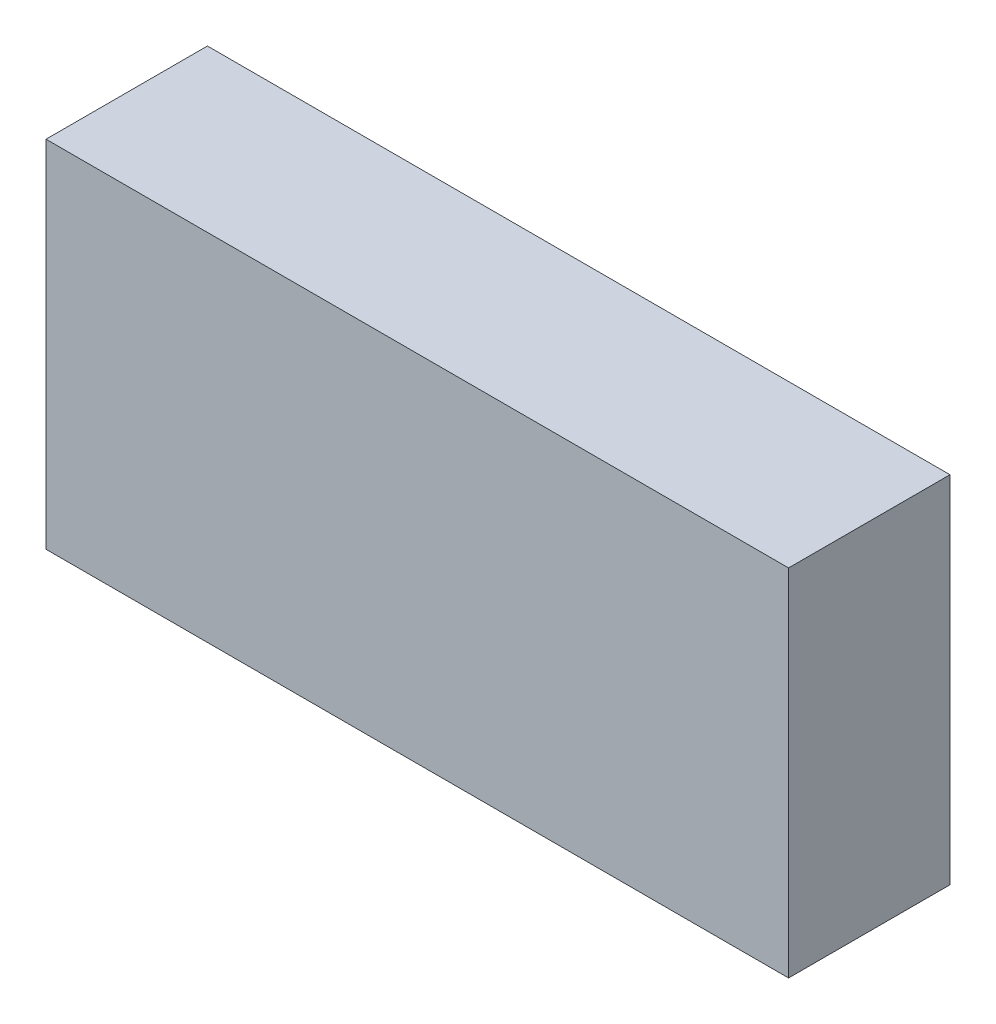
ISO-10303-21;
HEADER;
FILE_DESCRIPTION(('STEP AP214'),'2;1');
FILE_NAME('part.step','',(''),(''),'','','');
FILE_SCHEMA(('AUTOMOTIVE_DESIGN { 1 0 10303 214 1 1 1 1 }'));
ENDSEC;
DATA;
#1=APPLICATION_CONTEXT('core data for automotive mechanical design processes');
#2=APPLICATION_PROTOCOL_DEFINITION('international standard','automotive_design',2000,#1);
#3=PRODUCT_CONTEXT('',#1,'mechanical');
#4=PRODUCT('Part','Part','',(#3));
#5=PRODUCT_RELATED_PRODUCT_CATEGORY('part','',(#4));
#6=PRODUCT_DEFINITION_FORMATION('','',#4);
#7=PRODUCT_DEFINITION_CONTEXT('part definition',#1,'design');
#8=PRODUCT_DEFINITION('design','',#6,#7);
#9=PRODUCT_DEFINITION_SHAPE('','',#8);
#10=(LENGTH_UNIT() NAMED_UNIT(*) SI_UNIT(.MILLI.,.METRE.));
#11=(NAMED_UNIT(*) PLANE_ANGLE_UNIT() SI_UNIT($,.RADIAN.));
#12=(NAMED_UNIT(*) SI_UNIT($,.STERADIAN.) SOLID_ANGLE_UNIT());
#13=UNCERTAINTY_MEASURE_WITH_UNIT(LENGTH_MEASURE(1.E-05),#10,'distance_accuracy_value','');
#14=(GEOMETRIC_REPRESENTATION_CONTEXT(3) GLOBAL_UNCERTAINTY_ASSIGNED_CONTEXT((#13)) GLOBAL_UNIT_ASSIGNED_CONTEXT((#10,
#11,#12)) REPRESENTATION_CONTEXT('',''));
#15=CARTESIAN_POINT('',(0.,0.,0.));
#16=DIRECTION('',(0.,0.,1.));
#17=DIRECTION('',(1.,0.,0.));
#18=AXIS2_PLACEMENT_3D('',#15,#16,#17);
#19=CARTESIAN_POINT('',(-115.,110.,-25.));
#20=DIRECTION('',(1.,0.,0.));
#21=DIRECTION('',(0.,0.,-1.));
#22=AXIS2_PLACEMENT_3D('',#19,#20,#21);
#23=PLANE('',#22);
#24=DIRECTION('',(0.,0.,1.));
#25=VECTOR('',#24,1.);
#26=CARTESIAN_POINT('',(-115.,0.,-25.));
#27=LINE('',#26,#25);
#28=CARTESIAN_POINT('',(-115.,0.,-25.));
#29=VERTEX_POINT('',#28);
#30=CARTESIAN_POINT('',(-115.,0.,25.));
#31=VERTEX_POINT('',#30);
#32=EDGE_CURVE('E107',#29,#31,#27,.T.);
#33=ORIENTED_EDGE('',*,*,#32,.T.);
#34=DIRECTION('',(0.,-1.,0.));
#35=VECTOR('',#34,1.);
#36=CARTESIAN_POINT('',(-115.,110.,25.));
#37=LINE('',#36,#35);
#38=CARTESIAN_POINT('',(-115.,110.,25.));
#39=VERTEX_POINT('',#38);
#40=EDGE_CURVE('E11',#39,#31,#37,.T.);
#41=ORIENTED_EDGE('',*,*,#40,.F.);
#42=DIRECTION('',(0.,0.,1.));
#43=VECTOR('',#42,1.);
#44=CARTESIAN_POINT('',(-115.,110.,-25.));
#45=LINE('',#44,#43);
#46=CARTESIAN_POINT('',(-115.,110.,-25.));
#47=VERTEX_POINT('',#46);
#48=EDGE_CURVE('E91',#47,#39,#45,.T.);
#49=ORIENTED_EDGE('',*,*,#48,.F.);
#50=DIRECTION('',(0.,-1.,0.));
#51=VECTOR('',#50,1.);
#52=CARTESIAN_POINT('',(-115.,110.,-25.));
#53=LINE('',#52,#51);
#54=EDGE_CURVE('E103',#47,#29,#53,.T.);
#55=ORIENTED_EDGE('',*,*,#54,.T.);
#56=EDGE_LOOP('',(#33,#41,#49,#55));
#57=FACE_BOUND('',#56,.T.);
#58=ADVANCED_FACE('F39',(#57),#23,.F.);
#59=CARTESIAN_POINT('',(-115.,110.,25.));
#60=DIRECTION('',(0.,0.,-1.));
#61=DIRECTION('',(-1.,0.,0.));
#62=AXIS2_PLACEMENT_3D('',#59,#60,#61);
#63=PLANE('',#62);
#64=DIRECTION('',(1.,0.,0.));
#65=VECTOR('',#64,1.);
#66=CARTESIAN_POINT('',(-115.,0.,25.));
#67=LINE('',#66,#65);
#68=CARTESIAN_POINT('',(115.,0.,25.));
#69=VERTEX_POINT('',#68);
#70=EDGE_CURVE('E96',#31,#69,#67,.T.);
#71=ORIENTED_EDGE('',*,*,#70,.T.);
#72=DIRECTION('',(0.,-1.,0.));
#73=VECTOR('',#72,1.);
#74=CARTESIAN_POINT('',(115.,110.,25.));
#75=LINE('',#74,#73);
#76=CARTESIAN_POINT('',(115.,110.,25.));
#77=VERTEX_POINT('',#76);
#78=EDGE_CURVE('E48',#77,#69,#75,.T.);
#79=ORIENTED_EDGE('',*,*,#78,.F.);
#80=DIRECTION('',(1.,0.,0.));
#81=VECTOR('',#80,1.);
#82=CARTESIAN_POINT('',(-115.,110.,25.));
#83=LINE('',#82,#81);
#84=EDGE_CURVE('E86',#39,#77,#83,.T.);
#85=ORIENTED_EDGE('',*,*,#84,.F.);
#86=ORIENTED_EDGE('',*,*,#40,.T.);
#87=EDGE_LOOP('',(#71,#79,#85,#86));
#88=FACE_BOUND('',#87,.T.);
#89=ADVANCED_FACE('F95',(#88),#63,.F.);
#90=CARTESIAN_POINT('',(115.,110.,-25.));
#91=DIRECTION('',(-1.,0.,0.));
#92=DIRECTION('',(0.,0.,1.));
#93=AXIS2_PLACEMENT_3D('',#90,#91,#92);
#94=PLANE('',#93);
#95=DIRECTION('',(0.,0.,-1.));
#96=VECTOR('',#95,1.);
#97=CARTESIAN_POINT('',(115.,0.,-25.));
#98=LINE('',#97,#96);
#99=CARTESIAN_POINT('',(115.,0.,-25.));
#100=VERTEX_POINT('',#99);
#101=EDGE_CURVE('E73',#69,#100,#98,.T.);
#102=ORIENTED_EDGE('',*,*,#101,.T.);
#103=DIRECTION('',(0.,-1.,0.));
#104=VECTOR('',#103,1.);
#105=CARTESIAN_POINT('',(115.,110.,-25.));
#106=LINE('',#105,#104);
#107=CARTESIAN_POINT('',(115.,110.,-25.));
#108=VERTEX_POINT('',#107);
#109=EDGE_CURVE('E98',#108,#100,#106,.T.);
#110=ORIENTED_EDGE('',*,*,#109,.F.);
#111=DIRECTION('',(0.,0.,-1.));
#112=VECTOR('',#111,1.);
#113=CARTESIAN_POINT('',(115.,110.,-25.));
#114=LINE('',#113,#112);
#115=EDGE_CURVE('E89',#77,#108,#114,.T.);
#116=ORIENTED_EDGE('',*,*,#115,.F.);
#117=ORIENTED_EDGE('',*,*,#78,.T.);
#118=EDGE_LOOP('',(#102,#110,#116,#117));
#119=FACE_BOUND('',#118,.T.);
#120=ADVANCED_FACE('F99',(#119),#94,.F.);
#121=CARTESIAN_POINT('',(-115.,110.,-25.));
#122=DIRECTION('',(0.,0.,1.));
#123=DIRECTION('',(1.,0.,0.));
#124=AXIS2_PLACEMENT_3D('',#121,#122,#123);
#125=PLANE('',#124);
#126=DIRECTION('',(-1.,0.,0.));
#127=VECTOR('',#126,1.);
#128=CARTESIAN_POINT('',(-115.,0.,-25.));
#129=LINE('',#128,#127);
#130=EDGE_CURVE('E79',#100,#29,#129,.T.);
#131=ORIENTED_EDGE('',*,*,#130,.T.);
#132=ORIENTED_EDGE('',*,*,#54,.F.);
#133=DIRECTION('',(-1.,0.,0.));
#134=VECTOR('',#133,1.);
#135=CARTESIAN_POINT('',(-115.,110.,-25.));
#136=LINE('',#135,#134);
#137=EDGE_CURVE('E56',#108,#47,#136,.T.);
#138=ORIENTED_EDGE('',*,*,#137,.F.);
#139=ORIENTED_EDGE('',*,*,#109,.T.);
#140=EDGE_LOOP('',(#131,#132,#138,#139));
#141=FACE_BOUND('',#140,.T.);
#142=ADVANCED_FACE('F120',(#141),#125,.F.);
#143=CARTESIAN_POINT('',(0.,110.,0.));
#144=DIRECTION('',(0.,1.,0.));
#145=DIRECTION('',(0.,0.,1.));
#146=AXIS2_PLACEMENT_3D('',#143,#144,#145);
#147=PLANE('',#146);
#148=ORIENTED_EDGE('',*,*,#48,.T.);
#149=ORIENTED_EDGE('',*,*,#84,.T.);
#150=ORIENTED_EDGE('',*,*,#115,.T.);
#151=ORIENTED_EDGE('',*,*,#137,.T.);
#152=EDGE_LOOP('',(#148,#149,#150,#151));
#153=FACE_BOUND('',#152,.T.);
#154=ADVANCED_FACE('F87',(#153),#147,.T.);
#155=CARTESIAN_POINT('',(0.,0.,0.));
#156=DIRECTION('',(0.,1.,0.));
#157=DIRECTION('',(0.,0.,1.));
#158=AXIS2_PLACEMENT_3D('',#155,#156,#157);
#159=PLANE('',#158);
#160=ORIENTED_EDGE('',*,*,#32,.F.);
#161=ORIENTED_EDGE('',*,*,#130,.F.);
#162=ORIENTED_EDGE('',*,*,#101,.F.);
#163=ORIENTED_EDGE('',*,*,#70,.F.);
#164=EDGE_LOOP('',(#160,#161,#162,#163));
#165=FACE_BOUND('',#164,.T.);
#166=ADVANCED_FACE('F123',(#165),#159,.F.);
#167=CLOSED_SHELL('',(#58,#89,#120,#142,#154,#166));
#168=MANIFOLD_SOLID_BREP('B2',#167);
#169=ADVANCED_BREP_SHAPE_REPRESENTATION('',(#18,#168),#14);
#170=SHAPE_DEFINITION_REPRESENTATION(#9,#169);
ENDSEC;
END-ISO-10303-21;
